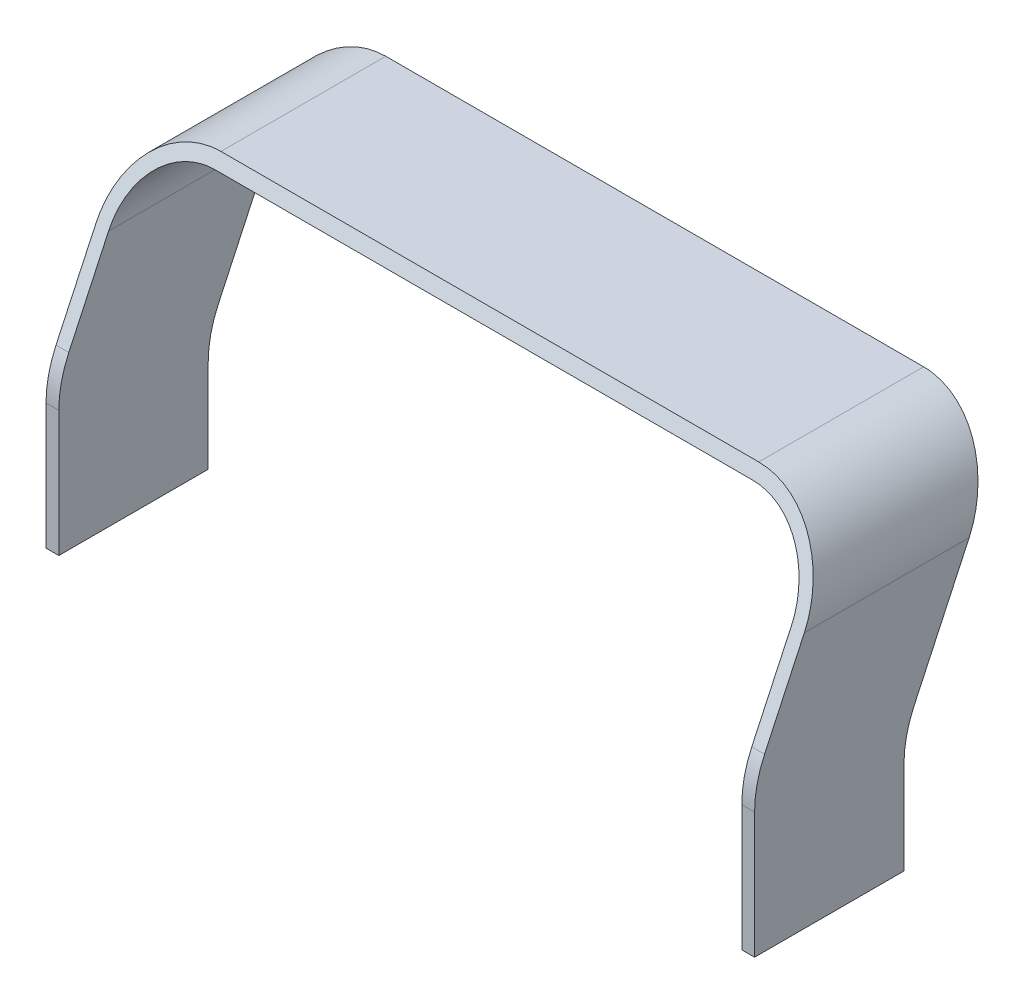
ISO-10303-21;
HEADER;
FILE_DESCRIPTION(('STEP AP214'),'2;1');
FILE_NAME('part.step','',(''),(''),'','','');
FILE_SCHEMA(('AUTOMOTIVE_DESIGN { 1 0 10303 214 1 1 1 1 }'));
ENDSEC;
DATA;
#1=APPLICATION_CONTEXT('core data for automotive mechanical design processes');
#2=APPLICATION_PROTOCOL_DEFINITION('international standard','automotive_design',2000,#1);
#3=PRODUCT_CONTEXT('',#1,'mechanical');
#4=PRODUCT('Part','Part','',(#3));
#5=PRODUCT_RELATED_PRODUCT_CATEGORY('part','',(#4));
#6=PRODUCT_DEFINITION_FORMATION('','',#4);
#7=PRODUCT_DEFINITION_CONTEXT('part definition',#1,'design');
#8=PRODUCT_DEFINITION('design','',#6,#7);
#9=PRODUCT_DEFINITION_SHAPE('','',#8);
#10=(LENGTH_UNIT() NAMED_UNIT(*) SI_UNIT(.MILLI.,.METRE.));
#11=(NAMED_UNIT(*) PLANE_ANGLE_UNIT() SI_UNIT($,.RADIAN.));
#12=(NAMED_UNIT(*) SI_UNIT($,.STERADIAN.) SOLID_ANGLE_UNIT());
#13=UNCERTAINTY_MEASURE_WITH_UNIT(LENGTH_MEASURE(1.E-05),#10,'distance_accuracy_value','');
#14=(GEOMETRIC_REPRESENTATION_CONTEXT(3) GLOBAL_UNCERTAINTY_ASSIGNED_CONTEXT((#13)) GLOBAL_UNIT_ASSIGNED_CONTEXT((#10,
#11,#12)) REPRESENTATION_CONTEXT('',''));
#15=CARTESIAN_POINT('',(0.,0.,0.));
#16=DIRECTION('',(0.,0.,1.));
#17=DIRECTION('',(1.,0.,0.));
#18=AXIS2_PLACEMENT_3D('',#15,#16,#17);
#19=CARTESIAN_POINT('',(-63.,65.,70.));
#20=DIRECTION('',(0.,0.,-1.));
#21=DIRECTION('',(-1.,0.,0.));
#22=AXIS2_PLACEMENT_3D('',#19,#20,#21);
#23=PLANE('',#22);
#24=DIRECTION('',(0.,1.,0.));
#25=VECTOR('',#24,1.);
#26=CARTESIAN_POINT('',(83.0000000000003,64.9999999999999,70.));
#27=LINE('',#26,#25);
#28=CARTESIAN_POINT('',(83.0000000000003,5.,70.));
#29=VERTEX_POINT('',#28);
#30=CARTESIAN_POINT('',(83.0000000000003,34.4576334339265,70.));
#31=VERTEX_POINT('',#30);
#32=EDGE_CURVE('E297',#29,#31,#27,.T.);
#33=ORIENTED_EDGE('',*,*,#32,.T.);
#34=DIRECTION('',(-1.,0.,0.));
#35=VECTOR('',#34,1.);
#36=CARTESIAN_POINT('',(-63.,34.4576334339265,70.));
#37=LINE('',#36,#35);
#38=CARTESIAN_POINT('',(80.0000000000003,34.4576334339265,70.));
#39=VERTEX_POINT('',#38);
#40=EDGE_CURVE('E246',#31,#39,#37,.T.);
#41=ORIENTED_EDGE('',*,*,#40,.T.);
#42=DIRECTION('',(0.,-1.,0.));
#43=VECTOR('',#42,1.);
#44=CARTESIAN_POINT('',(80.0000000000003,65.,70.));
#45=LINE('',#44,#43);
#46=CARTESIAN_POINT('',(80.0000000000003,5.00000000000001,70.));
#47=VERTEX_POINT('',#46);
#48=EDGE_CURVE('E293',#39,#47,#45,.T.);
#49=ORIENTED_EDGE('',*,*,#48,.T.);
#50=DIRECTION('',(1.,0.,0.));
#51=VECTOR('',#50,1.);
#52=CARTESIAN_POINT('',(80.0000000000003,5.00000000000001,70.));
#53=LINE('',#52,#51);
#54=EDGE_CURVE('E295',#47,#29,#53,.T.);
#55=ORIENTED_EDGE('',*,*,#54,.T.);
#56=EDGE_LOOP('',(#33,#41,#49,#55));
#57=FACE_BOUND('',#56,.T.);
#58=ADVANCED_FACE('F35',(#57),#23,.F.);
#59=CARTESIAN_POINT('',(-83.,4.99999999999997,70.));
#60=DIRECTION('',(0.,1.,0.));
#61=DIRECTION('',(-1.,0.,0.));
#62=AXIS2_PLACEMENT_3D('',#59,#60,#61);
#63=PLANE('',#62);
#64=DIRECTION('',(0.,0.,-1.));
#65=VECTOR('',#64,1.);
#66=CARTESIAN_POINT('',(-83.,4.99999999999997,70.));
#67=LINE('',#66,#65);
#68=CARTESIAN_POINT('',(-83.,4.99999999999997,70.));
#69=VERTEX_POINT('',#68);
#70=CARTESIAN_POINT('',(-83.,4.99999999999997,35.));
#71=VERTEX_POINT('',#70);
#72=EDGE_CURVE('E203',#69,#71,#67,.T.);
#73=ORIENTED_EDGE('',*,*,#72,.T.);
#74=DIRECTION('',(1.,0.,0.));
#75=VECTOR('',#74,1.);
#76=CARTESIAN_POINT('',(-83.,4.99999999999997,35.));
#77=LINE('',#76,#75);
#78=CARTESIAN_POINT('',(-80.,5.00000000000001,35.));
#79=VERTEX_POINT('',#78);
#80=EDGE_CURVE('E196',#71,#79,#77,.T.);
#81=ORIENTED_EDGE('',*,*,#80,.T.);
#82=DIRECTION('',(0.,0.,-1.));
#83=VECTOR('',#82,1.);
#84=CARTESIAN_POINT('',(-80.,5.00000000000001,70.));
#85=LINE('',#84,#83);
#86=CARTESIAN_POINT('',(-80.,5.00000000000001,70.));
#87=VERTEX_POINT('',#86);
#88=EDGE_CURVE('E235',#87,#79,#85,.T.);
#89=ORIENTED_EDGE('',*,*,#88,.F.);
#90=DIRECTION('',(1.,0.,0.));
#91=VECTOR('',#90,1.);
#92=CARTESIAN_POINT('',(-83.,4.99999999999997,70.));
#93=LINE('',#92,#91);
#94=EDGE_CURVE('E283',#69,#87,#93,.T.);
#95=ORIENTED_EDGE('',*,*,#94,.F.);
#96=EDGE_LOOP('',(#73,#81,#89,#95));
#97=FACE_BOUND('',#96,.T.);
#98=ADVANCED_FACE('F304',(#97),#63,.F.);
#99=CARTESIAN_POINT('',(-80.,5.00000000000001,70.));
#100=DIRECTION('',(-1.,0.,0.));
#101=DIRECTION('',(0.,0.,1.));
#102=AXIS2_PLACEMENT_3D('',#99,#100,#101);
#103=PLANE('',#102);
#104=DIRECTION('',(0.,-0.906307787036649,0.422618261740701));
#105=VECTOR('',#104,1.);
#106=CARTESIAN_POINT('',(-80.,11.2512168304856,83.4057777545822));
#107=LINE('',#106,#105);
#108=CARTESIAN_POINT('',(-80.,65.,58.342308546125));
#109=VERTEX_POINT('',#108);
#110=CARTESIAN_POINT('',(-80.,45.023089977444,67.6576946759162));
#111=VERTEX_POINT('',#110);
#112=EDGE_CURVE('E308',#109,#111,#107,.T.);
#113=ORIENTED_EDGE('',*,*,#112,.T.);
#114=CARTESIAN_POINT('',(-80.,34.4576334339265,45.));
#115=DIRECTION('',(-1.,0.,0.));
#116=DIRECTION('',(0.,0.,1.));
#117=AXIS2_PLACEMENT_3D('',#114,#115,#116);
#118=CIRCLE('',#117,25.);
#119=CARTESIAN_POINT('',(-80.,34.4576334339265,70.));
#120=VERTEX_POINT('',#119);
#121=EDGE_CURVE('E58',#111,#120,#118,.F.);
#122=ORIENTED_EDGE('',*,*,#121,.T.);
#123=DIRECTION('',(0.,1.,0.));
#124=VECTOR('',#123,1.);
#125=CARTESIAN_POINT('',(-80.,5.00000000000001,70.));
#126=LINE('',#125,#124);
#127=EDGE_CURVE('E286',#87,#120,#126,.T.);
#128=ORIENTED_EDGE('',*,*,#127,.F.);
#129=ORIENTED_EDGE('',*,*,#88,.T.);
#130=DIRECTION('',(0.,1.,0.));
#131=VECTOR('',#130,1.);
#132=CARTESIAN_POINT('',(-80.,5.00000000000001,35.));
#133=LINE('',#132,#131);
#134=CARTESIAN_POINT('',(-80.,26.6983202414236,35.));
#135=VERTEX_POINT('',#134);
#136=EDGE_CURVE('E280',#79,#135,#133,.T.);
#137=ORIENTED_EDGE('',*,*,#136,.T.);
#138=CARTESIAN_POINT('',(-80.,26.6983202414236,10.));
#139=DIRECTION('',(-1.,0.,0.));
#140=DIRECTION('',(0.,0.,1.));
#141=AXIS2_PLACEMENT_3D('',#138,#139,#140);
#142=CIRCLE('',#141,25.);
#143=CARTESIAN_POINT('',(-80.,37.2637767849411,32.6576946759162));
#144=VERTEX_POINT('',#143);
#145=EDGE_CURVE('E11',#135,#144,#142,.T.);
#146=ORIENTED_EDGE('',*,*,#145,.T.);
#147=DIRECTION('',(0.,0.906307787036649,-0.422618261740701));
#148=VECTOR('',#147,1.);
#149=CARTESIAN_POINT('',(-80.,-3.54042233043891,51.6850052082995));
#150=LINE('',#149,#148);
#151=CARTESIAN_POINT('',(-80.,65.,19.7240813824378));
#152=VERTEX_POINT('',#151);
#153=EDGE_CURVE('E278',#144,#152,#150,.T.);
#154=ORIENTED_EDGE('',*,*,#153,.T.);
#155=DIRECTION('',(0.,0.,-1.));
#156=VECTOR('',#155,1.);
#157=CARTESIAN_POINT('',(-80.,65.,70.));
#158=LINE('',#157,#156);
#159=EDGE_CURVE('E232',#109,#152,#158,.T.);
#160=ORIENTED_EDGE('',*,*,#159,.F.);
#161=EDGE_LOOP('',(#113,#122,#128,#129,#137,#146,#154,#160));
#162=FACE_BOUND('',#161,.T.);
#163=ADVANCED_FACE('F276',(#162),#103,.F.);
#164=CARTESIAN_POINT('',(-63.,65.,70.));
#165=DIRECTION('',(0.,0.,-1.));
#166=DIRECTION('',(-1.,0.,0.));
#167=AXIS2_PLACEMENT_3D('',#164,#165,#166);
#168=CYLINDRICAL_SURFACE('',#167,17.);
#169=DIRECTION('',(0.,0.,-1.));
#170=VECTOR('',#169,1.);
#171=CARTESIAN_POINT('',(-63.,82.,70.));
#172=LINE('',#171,#170);
#173=CARTESIAN_POINT('',(-63.,82.,50.41507835749));
#174=VERTEX_POINT('',#173);
#175=CARTESIAN_POINT('',(-63.,82.,11.7968511938027));
#176=VERTEX_POINT('',#175);
#177=EDGE_CURVE('E229',#174,#176,#172,.T.);
#178=ORIENTED_EDGE('',*,*,#177,.F.);
#179=CARTESIAN_POINT('',(-63.,65.,58.342308546125));
#180=DIRECTION('',(0.,-0.422618261740701,-0.906307787036649));
#181=DIRECTION('',(0.,0.906307787036649,-0.422618261740701));
#182=AXIS2_PLACEMENT_3D('',#179,#180,#181);
#183=ELLIPSE('',#182,18.7574246223624,17.);
#184=EDGE_CURVE('E311',#174,#109,#183,.F.);
#185=ORIENTED_EDGE('',*,*,#184,.T.);
#186=ORIENTED_EDGE('',*,*,#159,.T.);
#187=CARTESIAN_POINT('',(-63.,65.,19.7240813824377));
#188=DIRECTION('',(0.,0.422618261740701,0.906307787036649));
#189=DIRECTION('',(0.,0.906307787036649,-0.422618261740701));
#190=AXIS2_PLACEMENT_3D('',#187,#188,#189);
#191=ELLIPSE('',#190,18.7574246223624,17.);
#192=EDGE_CURVE('E282',#152,#176,#191,.F.);
#193=ORIENTED_EDGE('',*,*,#192,.T.);
#194=EDGE_LOOP('',(#178,#185,#186,#193));
#195=FACE_BOUND('',#194,.T.);
#196=ADVANCED_FACE('F434',(#195),#168,.F.);
#197=CARTESIAN_POINT('',(-63.,82.,70.));
#198=DIRECTION('',(0.,1.,0.));
#199=DIRECTION('',(0.,0.,1.));
#200=AXIS2_PLACEMENT_3D('',#197,#198,#199);
#201=PLANE('',#200);
#202=DIRECTION('',(0.,0.,-1.));
#203=VECTOR('',#202,1.);
#204=CARTESIAN_POINT('',(63.0000000000003,82.,70.));
#205=LINE('',#204,#203);
#206=CARTESIAN_POINT('',(63.0000000000003,82.,50.41507835749));
#207=VERTEX_POINT('',#206);
#208=CARTESIAN_POINT('',(63.0000000000003,82.,11.7968511938027));
#209=VERTEX_POINT('',#208);
#210=EDGE_CURVE('E226',#207,#209,#205,.T.);
#211=ORIENTED_EDGE('',*,*,#210,.F.);
#212=DIRECTION('',(-1.,0.,0.));
#213=VECTOR('',#212,1.);
#214=CARTESIAN_POINT('',(-63.,82.,50.41507835749));
#215=LINE('',#214,#213);
#216=EDGE_CURVE('E316',#207,#174,#215,.T.);
#217=ORIENTED_EDGE('',*,*,#216,.T.);
#218=ORIENTED_EDGE('',*,*,#177,.T.);
#219=DIRECTION('',(1.,0.,0.));
#220=VECTOR('',#219,1.);
#221=CARTESIAN_POINT('',(-63.,82.,11.7968511938027));
#222=LINE('',#221,#220);
#223=EDGE_CURVE('E288',#176,#209,#222,.T.);
#224=ORIENTED_EDGE('',*,*,#223,.T.);
#225=EDGE_LOOP('',(#211,#217,#218,#224));
#226=FACE_BOUND('',#225,.T.);
#227=ADVANCED_FACE('F333',(#226),#201,.F.);
#228=CARTESIAN_POINT('',(63.0000000000003,65.,70.));
#229=DIRECTION('',(0.,0.,-1.));
#230=DIRECTION('',(-1.,0.,0.));
#231=AXIS2_PLACEMENT_3D('',#228,#229,#230);
#232=CYLINDRICAL_SURFACE('',#231,17.);
#233=DIRECTION('',(0.,0.,-1.));
#234=VECTOR('',#233,1.);
#235=CARTESIAN_POINT('',(80.0000000000003,65.,70.));
#236=LINE('',#235,#234);
#237=CARTESIAN_POINT('',(80.0000000000003,65.,58.342308546125));
#238=VERTEX_POINT('',#237);
#239=CARTESIAN_POINT('',(80.0000000000003,65.,19.7240813824378));
#240=VERTEX_POINT('',#239);
#241=EDGE_CURVE('E223',#238,#240,#236,.T.);
#242=ORIENTED_EDGE('',*,*,#241,.F.);
#243=CARTESIAN_POINT('',(63.0000000000003,65.,58.342308546125));
#244=DIRECTION('',(0.,-0.422618261740701,-0.906307787036649));
#245=DIRECTION('',(0.,0.906307787036649,-0.422618261740701));
#246=AXIS2_PLACEMENT_3D('',#243,#244,#245);
#247=ELLIPSE('',#246,18.7574246223624,17.);
#248=EDGE_CURVE('E341',#238,#207,#247,.F.);
#249=ORIENTED_EDGE('',*,*,#248,.T.);
#250=ORIENTED_EDGE('',*,*,#210,.T.);
#251=CARTESIAN_POINT('',(63.0000000000003,65.,19.7240813824378));
#252=DIRECTION('',(0.,0.422618261740701,0.906307787036649));
#253=DIRECTION('',(0.,0.906307787036649,-0.422618261740701));
#254=AXIS2_PLACEMENT_3D('',#251,#252,#253);
#255=ELLIPSE('',#254,18.7574246223624,17.);
#256=EDGE_CURVE('E328',#209,#240,#255,.F.);
#257=ORIENTED_EDGE('',*,*,#256,.T.);
#258=EDGE_LOOP('',(#242,#249,#250,#257));
#259=FACE_BOUND('',#258,.T.);
#260=ADVANCED_FACE('F339',(#259),#232,.F.);
#261=CARTESIAN_POINT('',(80.0000000000003,65.,70.));
#262=DIRECTION('',(1.,0.,0.));
#263=DIRECTION('',(0.,1.,0.));
#264=AXIS2_PLACEMENT_3D('',#261,#262,#263);
#265=PLANE('',#264);
#266=ORIENTED_EDGE('',*,*,#48,.F.);
#267=CARTESIAN_POINT('',(80.0000000000003,34.4576334339265,45.));
#268=DIRECTION('',(1.,0.,0.));
#269=DIRECTION('',(0.,1.,0.));
#270=AXIS2_PLACEMENT_3D('',#267,#268,#269);
#271=CIRCLE('',#270,25.);
#272=CARTESIAN_POINT('',(80.0000000000003,45.023089977444,67.6576946759162));
#273=VERTEX_POINT('',#272);
#274=EDGE_CURVE('E249',#39,#273,#271,.F.);
#275=ORIENTED_EDGE('',*,*,#274,.T.);
#276=DIRECTION('',(0.,0.906307787036649,-0.422618261740701));
#277=VECTOR('',#276,1.);
#278=CARTESIAN_POINT('',(80.0000000000003,60.5348451210817,60.4244444610128));
#279=LINE('',#278,#277);
#280=EDGE_CURVE('E342',#273,#238,#279,.T.);
#281=ORIENTED_EDGE('',*,*,#280,.T.);
#282=ORIENTED_EDGE('',*,*,#241,.T.);
#283=DIRECTION('',(0.,-0.906307787036649,0.422618261740701));
#284=VECTOR('',#283,1.);
#285=CARTESIAN_POINT('',(80.0000000000003,45.7432059601572,28.70367191473));
#286=LINE('',#285,#284);
#287=CARTESIAN_POINT('',(80.0000000000003,37.2637767849411,32.6576946759162));
#288=VERTEX_POINT('',#287);
#289=EDGE_CURVE('E325',#240,#288,#286,.T.);
#290=ORIENTED_EDGE('',*,*,#289,.T.);
#291=CARTESIAN_POINT('',(80.0000000000003,26.6983202414236,10.));
#292=DIRECTION('',(1.,0.,0.));
#293=DIRECTION('',(0.,1.,0.));
#294=AXIS2_PLACEMENT_3D('',#291,#292,#293);
#295=CIRCLE('',#294,25.);
#296=CARTESIAN_POINT('',(80.0000000000003,26.6983202414236,35.));
#297=VERTEX_POINT('',#296);
#298=EDGE_CURVE('E261',#288,#297,#295,.T.);
#299=ORIENTED_EDGE('',*,*,#298,.T.);
#300=DIRECTION('',(0.,-1.,0.));
#301=VECTOR('',#300,1.);
#302=CARTESIAN_POINT('',(80.0000000000003,65.,35.));
#303=LINE('',#302,#301);
#304=CARTESIAN_POINT('',(80.0000000000003,5.00000000000001,35.));
#305=VERTEX_POINT('',#304);
#306=EDGE_CURVE('E314',#297,#305,#303,.T.);
#307=ORIENTED_EDGE('',*,*,#306,.T.);
#308=DIRECTION('',(0.,0.,-1.));
#309=VECTOR('',#308,1.);
#310=CARTESIAN_POINT('',(80.0000000000003,5.00000000000001,70.));
#311=LINE('',#310,#309);
#312=EDGE_CURVE('E220',#47,#305,#311,.T.);
#313=ORIENTED_EDGE('',*,*,#312,.F.);
#314=EDGE_LOOP('',(#266,#275,#281,#282,#290,#299,#307,#313));
#315=FACE_BOUND('',#314,.T.);
#316=ADVANCED_FACE('F375',(#315),#265,.F.);
#317=CARTESIAN_POINT('',(80.0000000000003,5.00000000000001,70.));
#318=DIRECTION('',(0.,1.,0.));
#319=DIRECTION('',(-1.,0.,0.));
#320=AXIS2_PLACEMENT_3D('',#317,#318,#319);
#321=PLANE('',#320);
#322=ORIENTED_EDGE('',*,*,#312,.T.);
#323=DIRECTION('',(1.,0.,0.));
#324=VECTOR('',#323,1.);
#325=CARTESIAN_POINT('',(80.0000000000003,5.00000000000001,35.));
#326=LINE('',#325,#324);
#327=CARTESIAN_POINT('',(83.0000000000003,5.,35.));
#328=VERTEX_POINT('',#327);
#329=EDGE_CURVE('E310',#305,#328,#326,.T.);
#330=ORIENTED_EDGE('',*,*,#329,.T.);
#331=DIRECTION('',(0.,0.,-1.));
#332=VECTOR('',#331,1.);
#333=CARTESIAN_POINT('',(83.0000000000003,5.,70.));
#334=LINE('',#333,#332);
#335=EDGE_CURVE('E217',#29,#328,#334,.T.);
#336=ORIENTED_EDGE('',*,*,#335,.F.);
#337=ORIENTED_EDGE('',*,*,#54,.F.);
#338=EDGE_LOOP('',(#322,#330,#336,#337));
#339=FACE_BOUND('',#338,.T.);
#340=ADVANCED_FACE('F381',(#339),#321,.F.);
#341=CARTESIAN_POINT('',(83.0000000000003,64.9999999999999,70.));
#342=DIRECTION('',(-1.,0.,0.));
#343=DIRECTION('',(0.,-1.,0.));
#344=AXIS2_PLACEMENT_3D('',#341,#342,#343);
#345=PLANE('',#344);
#346=DIRECTION('',(0.,-0.906307787036649,0.422618261740701));
#347=VECTOR('',#346,1.);
#348=CARTESIAN_POINT('',(83.0000000000003,85.,49.016155383025));
#349=LINE('',#348,#347);
#350=CARTESIAN_POINT('',(83.0000000000003,65.,58.342308546125));
#351=VERTEX_POINT('',#350);
#352=CARTESIAN_POINT('',(83.0000000000003,45.023089977444,67.6576946759162));
#353=VERTEX_POINT('',#352);
#354=EDGE_CURVE('E359',#351,#353,#349,.T.);
#355=ORIENTED_EDGE('',*,*,#354,.T.);
#356=CARTESIAN_POINT('',(83.0000000000003,34.4576334339265,45.));
#357=DIRECTION('',(-1.,0.,0.));
#358=DIRECTION('',(0.,-1.,0.));
#359=AXIS2_PLACEMENT_3D('',#356,#357,#358);
#360=CIRCLE('',#359,25.);
#361=EDGE_CURVE('E255',#353,#31,#360,.F.);
#362=ORIENTED_EDGE('',*,*,#361,.T.);
#363=ORIENTED_EDGE('',*,*,#32,.F.);
#364=ORIENTED_EDGE('',*,*,#335,.T.);
#365=DIRECTION('',(0.,1.,0.));
#366=VECTOR('',#365,1.);
#367=CARTESIAN_POINT('',(83.0000000000003,32.2406868074971,35.));
#368=LINE('',#367,#366);
#369=CARTESIAN_POINT('',(83.0000000000003,26.6983202414236,35.));
#370=VERTEX_POINT('',#369);
#371=EDGE_CURVE('E184',#328,#370,#368,.T.);
#372=ORIENTED_EDGE('',*,*,#371,.T.);
#373=CARTESIAN_POINT('',(83.0000000000003,26.6983202414236,10.));
#374=DIRECTION('',(-1.,0.,0.));
#375=DIRECTION('',(0.,-1.,0.));
#376=AXIS2_PLACEMENT_3D('',#373,#374,#375);
#377=CIRCLE('',#376,25.);
#378=CARTESIAN_POINT('',(83.0000000000003,37.2637767849411,32.6576946759162));
#379=VERTEX_POINT('',#378);
#380=EDGE_CURVE('E263',#370,#379,#377,.T.);
#381=ORIENTED_EDGE('',*,*,#380,.T.);
#382=DIRECTION('',(0.,0.906307787036649,-0.422618261740701));
#383=VECTOR('',#382,1.);
#384=CARTESIAN_POINT('',(83.0000000000003,85.,10.3979282193377));
#385=LINE('',#384,#383);
#386=CARTESIAN_POINT('',(83.0000000000003,65.,19.7240813824378));
#387=VERTEX_POINT('',#386);
#388=EDGE_CURVE('E353',#379,#387,#385,.T.);
#389=ORIENTED_EDGE('',*,*,#388,.T.);
#390=DIRECTION('',(0.,0.,-1.));
#391=VECTOR('',#390,1.);
#392=CARTESIAN_POINT('',(83.0000000000003,64.9999999999999,70.));
#393=LINE('',#392,#391);
#394=EDGE_CURVE('E214',#351,#387,#393,.T.);
#395=ORIENTED_EDGE('',*,*,#394,.F.);
#396=EDGE_LOOP('',(#355,#362,#363,#364,#372,#381,#389,#395));
#397=FACE_BOUND('',#396,.T.);
#398=ADVANCED_FACE('F365',(#397),#345,.F.);
#399=CARTESIAN_POINT('',(63.0000000000003,65.,70.));
#400=DIRECTION('',(0.,0.,-1.));
#401=DIRECTION('',(-1.,0.,0.));
#402=AXIS2_PLACEMENT_3D('',#399,#400,#401);
#403=CYLINDRICAL_SURFACE('',#402,20.);
#404=DIRECTION('',(0.,0.,-1.));
#405=VECTOR('',#404,1.);
#406=CARTESIAN_POINT('',(63.0000000000001,85.,70.));
#407=LINE('',#406,#405);
#408=CARTESIAN_POINT('',(63.0000000000001,85.,49.016155383025));
#409=VERTEX_POINT('',#408);
#410=CARTESIAN_POINT('',(63.0000000000001,85.,10.3979282193377));
#411=VERTEX_POINT('',#410);
#412=EDGE_CURVE('E205',#409,#411,#407,.T.);
#413=ORIENTED_EDGE('',*,*,#412,.F.);
#414=CARTESIAN_POINT('',(63.0000000000003,65.,58.342308546125));
#415=DIRECTION('',(0.,-0.422618261740701,-0.906307787036649));
#416=DIRECTION('',(0.,0.906307787036649,-0.422618261740701));
#417=AXIS2_PLACEMENT_3D('',#414,#415,#416);
#418=ELLIPSE('',#417,22.0675583792499,20.);
#419=EDGE_CURVE('E344',#409,#351,#418,.T.);
#420=ORIENTED_EDGE('',*,*,#419,.T.);
#421=ORIENTED_EDGE('',*,*,#394,.T.);
#422=CARTESIAN_POINT('',(63.0000000000003,65.,19.7240813824378));
#423=DIRECTION('',(0.,0.422618261740701,0.906307787036649));
#424=DIRECTION('',(0.,0.906307787036649,-0.422618261740701));
#425=AXIS2_PLACEMENT_3D('',#422,#423,#424);
#426=ELLIPSE('',#425,22.0675583792499,20.);
#427=EDGE_CURVE('E195',#387,#411,#426,.T.);
#428=ORIENTED_EDGE('',*,*,#427,.T.);
#429=EDGE_LOOP('',(#413,#420,#421,#428));
#430=FACE_BOUND('',#429,.T.);
#431=ADVANCED_FACE('F419',(#430),#403,.T.);
#432=CARTESIAN_POINT('',(-62.9999999999999,85.,70.));
#433=DIRECTION('',(0.,-1.,0.));
#434=DIRECTION('',(0.,0.,-1.));
#435=AXIS2_PLACEMENT_3D('',#432,#433,#434);
#436=PLANE('',#435);
#437=DIRECTION('',(0.,0.,-1.));
#438=VECTOR('',#437,1.);
#439=CARTESIAN_POINT('',(-62.9999999999999,85.,70.));
#440=LINE('',#439,#438);
#441=CARTESIAN_POINT('',(-63.,85.,49.016155383025));
#442=VERTEX_POINT('',#441);
#443=CARTESIAN_POINT('',(-63.,85.,10.3979282193377));
#444=VERTEX_POINT('',#443);
#445=EDGE_CURVE('E194',#442,#444,#440,.T.);
#446=ORIENTED_EDGE('',*,*,#445,.F.);
#447=DIRECTION('',(-1.,0.,0.));
#448=VECTOR('',#447,1.);
#449=CARTESIAN_POINT('',(83.0000000000003,85.,49.016155383025));
#450=LINE('',#449,#448);
#451=EDGE_CURVE('E351',#409,#442,#450,.T.);
#452=ORIENTED_EDGE('',*,*,#451,.F.);
#453=ORIENTED_EDGE('',*,*,#412,.T.);
#454=DIRECTION('',(-1.,0.,0.));
#455=VECTOR('',#454,1.);
#456=CARTESIAN_POINT('',(83.0000000000003,85.,10.3979282193377));
#457=LINE('',#456,#455);
#458=EDGE_CURVE('E352',#411,#444,#457,.T.);
#459=ORIENTED_EDGE('',*,*,#458,.T.);
#460=EDGE_LOOP('',(#446,#452,#453,#459));
#461=FACE_BOUND('',#460,.T.);
#462=ADVANCED_FACE('F414',(#461),#436,.F.);
#463=CARTESIAN_POINT('',(-63.,65.,70.));
#464=DIRECTION('',(0.,0.,-1.));
#465=DIRECTION('',(-1.,0.,0.));
#466=AXIS2_PLACEMENT_3D('',#463,#464,#465);
#467=CYLINDRICAL_SURFACE('',#466,20.);
#468=DIRECTION('',(0.,0.,-1.));
#469=VECTOR('',#468,1.);
#470=CARTESIAN_POINT('',(-83.,64.9999999999999,70.));
#471=LINE('',#470,#469);
#472=CARTESIAN_POINT('',(-83.,64.9999999999999,58.3423085461251));
#473=VERTEX_POINT('',#472);
#474=CARTESIAN_POINT('',(-83.,64.9999999999999,19.7240813824378));
#475=VERTEX_POINT('',#474);
#476=EDGE_CURVE('E192',#473,#475,#471,.T.);
#477=ORIENTED_EDGE('',*,*,#476,.F.);
#478=CARTESIAN_POINT('',(-63.,65.,58.342308546125));
#479=DIRECTION('',(0.,-0.422618261740701,-0.906307787036649));
#480=DIRECTION('',(0.,0.906307787036649,-0.422618261740701));
#481=AXIS2_PLACEMENT_3D('',#478,#479,#480);
#482=ELLIPSE('',#481,22.0675583792498,20.);
#483=EDGE_CURVE('E349',#473,#442,#482,.T.);
#484=ORIENTED_EDGE('',*,*,#483,.T.);
#485=ORIENTED_EDGE('',*,*,#445,.T.);
#486=CARTESIAN_POINT('',(-63.,65.,19.7240813824377));
#487=DIRECTION('',(0.,0.422618261740701,0.906307787036649));
#488=DIRECTION('',(0.,0.906307787036649,-0.422618261740701));
#489=AXIS2_PLACEMENT_3D('',#486,#487,#488);
#490=ELLIPSE('',#489,22.0675583792498,20.);
#491=EDGE_CURVE('E177',#444,#475,#490,.T.);
#492=ORIENTED_EDGE('',*,*,#491,.T.);
#493=EDGE_LOOP('',(#477,#484,#485,#492));
#494=FACE_BOUND('',#493,.T.);
#495=ADVANCED_FACE('F190',(#494),#467,.T.);
#496=CARTESIAN_POINT('',(-83.,4.99999999999997,70.));
#497=DIRECTION('',(1.,0.,0.));
#498=DIRECTION('',(0.,0.,-1.));
#499=AXIS2_PLACEMENT_3D('',#496,#497,#498);
#500=PLANE('',#499);
#501=DIRECTION('',(0.,-1.,0.));
#502=VECTOR('',#501,1.);
#503=CARTESIAN_POINT('',(-83.,4.99999999999997,70.));
#504=LINE('',#503,#502);
#505=CARTESIAN_POINT('',(-83.,34.4576334339265,70.));
#506=VERTEX_POINT('',#505);
#507=EDGE_CURVE('E208',#506,#69,#504,.T.);
#508=ORIENTED_EDGE('',*,*,#507,.F.);
#509=CARTESIAN_POINT('',(-83.,34.4576334339265,45.));
#510=DIRECTION('',(1.,0.,0.));
#511=DIRECTION('',(0.,0.,-1.));
#512=AXIS2_PLACEMENT_3D('',#509,#510,#511);
#513=CIRCLE('',#512,25.);
#514=CARTESIAN_POINT('',(-83.,45.023089977444,67.6576946759162));
#515=VERTEX_POINT('',#514);
#516=EDGE_CURVE('E50',#506,#515,#513,.F.);
#517=ORIENTED_EDGE('',*,*,#516,.T.);
#518=DIRECTION('',(0.,-0.906307787036649,0.422618261740701));
#519=VECTOR('',#518,1.);
#520=CARTESIAN_POINT('',(-83.,85.,49.016155383025));
#521=LINE('',#520,#519);
#522=EDGE_CURVE('E202',#473,#515,#521,.T.);
#523=ORIENTED_EDGE('',*,*,#522,.F.);
#524=ORIENTED_EDGE('',*,*,#476,.T.);
#525=DIRECTION('',(0.,0.906307787036649,-0.422618261740701));
#526=VECTOR('',#525,1.);
#527=CARTESIAN_POINT('',(-83.,85.,10.3979282193377));
#528=LINE('',#527,#526);
#529=CARTESIAN_POINT('',(-83.,37.2637767849411,32.6576946759162));
#530=VERTEX_POINT('',#529);
#531=EDGE_CURVE('E173',#530,#475,#528,.T.);
#532=ORIENTED_EDGE('',*,*,#531,.F.);
#533=CARTESIAN_POINT('',(-83.,26.6983202414236,10.));
#534=DIRECTION('',(1.,0.,0.));
#535=DIRECTION('',(0.,0.,-1.));
#536=AXIS2_PLACEMENT_3D('',#533,#534,#535);
#537=CIRCLE('',#536,25.);
#538=CARTESIAN_POINT('',(-83.,26.6983202414236,35.));
#539=VERTEX_POINT('',#538);
#540=EDGE_CURVE('E43',#530,#539,#537,.T.);
#541=ORIENTED_EDGE('',*,*,#540,.T.);
#542=DIRECTION('',(0.,1.,0.));
#543=VECTOR('',#542,1.);
#544=CARTESIAN_POINT('',(-83.,32.2406868074971,35.));
#545=LINE('',#544,#543);
#546=EDGE_CURVE('E185',#71,#539,#545,.T.);
#547=ORIENTED_EDGE('',*,*,#546,.F.);
#548=ORIENTED_EDGE('',*,*,#72,.F.);
#549=EDGE_LOOP('',(#508,#517,#523,#524,#532,#541,#547,#548));
#550=FACE_BOUND('',#549,.T.);
#551=ADVANCED_FACE('F200',(#550),#500,.F.);
#552=ORIENTED_EDGE('',*,*,#127,.T.);
#553=DIRECTION('',(-1.,0.,0.));
#554=VECTOR('',#553,1.);
#555=CARTESIAN_POINT('',(-63.,34.4576334339265,70.));
#556=LINE('',#555,#554);
#557=EDGE_CURVE('E257',#120,#506,#556,.T.);
#558=ORIENTED_EDGE('',*,*,#557,.T.);
#559=ORIENTED_EDGE('',*,*,#507,.T.);
#560=ORIENTED_EDGE('',*,*,#94,.T.);
#561=EDGE_LOOP('',(#552,#558,#559,#560));
#562=FACE_BOUND('',#561,.T.);
#563=ADVANCED_FACE('F300',(#562),#23,.F.);
#564=CARTESIAN_POINT('',(83.0000000000003,85.,49.016155383025));
#565=DIRECTION('',(0.,-0.422618261740701,-0.906307787036649));
#566=DIRECTION('',(0.,0.906307787036649,-0.422618261740701));
#567=AXIS2_PLACEMENT_3D('',#564,#565,#566);
#568=PLANE('',#567);
#569=ORIENTED_EDGE('',*,*,#280,.F.);
#570=DIRECTION('',(-1.,0.,0.));
#571=VECTOR('',#570,1.);
#572=CARTESIAN_POINT('',(83.0000000000003,45.023089977444,67.6576946759162));
#573=LINE('',#572,#571);
#574=EDGE_CURVE('E253',#273,#353,#573,.F.);
#575=ORIENTED_EDGE('',*,*,#574,.T.);
#576=ORIENTED_EDGE('',*,*,#354,.F.);
#577=ORIENTED_EDGE('',*,*,#419,.F.);
#578=ORIENTED_EDGE('',*,*,#451,.T.);
#579=ORIENTED_EDGE('',*,*,#483,.F.);
#580=ORIENTED_EDGE('',*,*,#522,.T.);
#581=DIRECTION('',(-1.,0.,0.));
#582=VECTOR('',#581,1.);
#583=CARTESIAN_POINT('',(83.0000000000003,45.023089977444,67.6576946759162));
#584=LINE('',#583,#582);
#585=EDGE_CURVE('E251',#515,#111,#584,.F.);
#586=ORIENTED_EDGE('',*,*,#585,.T.);
#587=ORIENTED_EDGE('',*,*,#112,.F.);
#588=ORIENTED_EDGE('',*,*,#184,.F.);
#589=ORIENTED_EDGE('',*,*,#216,.F.);
#590=ORIENTED_EDGE('',*,*,#248,.F.);
#591=EDGE_LOOP('',(#569,#575,#576,#577,#578,#579,#580,#586,#587,#588,#589,#590));
#592=FACE_BOUND('',#591,.T.);
#593=ADVANCED_FACE('F307',(#592),#568,.F.);
#594=CARTESIAN_POINT('',(83.0000000000003,85.,10.3979282193377));
#595=DIRECTION('',(0.,0.422618261740701,0.906307787036649));
#596=DIRECTION('',(0.,-0.906307787036649,0.422618261740701));
#597=AXIS2_PLACEMENT_3D('',#594,#595,#596);
#598=PLANE('',#597);
#599=ORIENTED_EDGE('',*,*,#388,.F.);
#600=DIRECTION('',(-1.,0.,0.));
#601=VECTOR('',#600,1.);
#602=CARTESIAN_POINT('',(80.0000000000003,37.2637767849411,32.6576946759162));
#603=LINE('',#602,#601);
#604=EDGE_CURVE('E239',#379,#288,#603,.T.);
#605=ORIENTED_EDGE('',*,*,#604,.T.);
#606=ORIENTED_EDGE('',*,*,#289,.F.);
#607=ORIENTED_EDGE('',*,*,#256,.F.);
#608=ORIENTED_EDGE('',*,*,#223,.F.);
#609=ORIENTED_EDGE('',*,*,#192,.F.);
#610=ORIENTED_EDGE('',*,*,#153,.F.);
#611=DIRECTION('',(-1.,0.,0.));
#612=VECTOR('',#611,1.);
#613=CARTESIAN_POINT('',(-82.9999999999999,37.2637767849411,32.6576946759162));
#614=LINE('',#613,#612);
#615=EDGE_CURVE('E181',#144,#530,#614,.T.);
#616=ORIENTED_EDGE('',*,*,#615,.T.);
#617=ORIENTED_EDGE('',*,*,#531,.T.);
#618=ORIENTED_EDGE('',*,*,#491,.F.);
#619=ORIENTED_EDGE('',*,*,#458,.F.);
#620=ORIENTED_EDGE('',*,*,#427,.F.);
#621=EDGE_LOOP('',(#599,#605,#606,#607,#608,#609,#610,#616,#617,#618,#619,#620));
#622=FACE_BOUND('',#621,.T.);
#623=ADVANCED_FACE('F176',(#622),#598,.F.);
#624=CARTESIAN_POINT('',(83.0000000000003,32.2406868074971,35.));
#625=DIRECTION('',(0.,0.,1.));
#626=DIRECTION('',(1.,0.,0.));
#627=AXIS2_PLACEMENT_3D('',#624,#625,#626);
#628=PLANE('',#627);
#629=ORIENTED_EDGE('',*,*,#546,.T.);
#630=DIRECTION('',(-1.,0.,0.));
#631=VECTOR('',#630,1.);
#632=CARTESIAN_POINT('',(-79.9999999999999,26.6983202414236,35.));
#633=LINE('',#632,#631);
#634=EDGE_CURVE('E244',#539,#135,#633,.F.);
#635=ORIENTED_EDGE('',*,*,#634,.T.);
#636=ORIENTED_EDGE('',*,*,#136,.F.);
#637=ORIENTED_EDGE('',*,*,#80,.F.);
#638=EDGE_LOOP('',(#629,#635,#636,#637));
#639=FACE_BOUND('',#638,.T.);
#640=ADVANCED_FACE('F270',(#639),#628,.F.);
#641=ORIENTED_EDGE('',*,*,#306,.F.);
#642=DIRECTION('',(-1.,0.,0.));
#643=VECTOR('',#642,1.);
#644=CARTESIAN_POINT('',(83.0000000000003,26.6983202414236,35.));
#645=LINE('',#644,#643);
#646=EDGE_CURVE('E242',#297,#370,#645,.F.);
#647=ORIENTED_EDGE('',*,*,#646,.T.);
#648=ORIENTED_EDGE('',*,*,#371,.F.);
#649=ORIENTED_EDGE('',*,*,#329,.F.);
#650=EDGE_LOOP('',(#641,#647,#648,#649));
#651=FACE_BOUND('',#650,.T.);
#652=ADVANCED_FACE('F389',(#651),#628,.F.);
#653=CARTESIAN_POINT('',(83.0000000000003,26.6983202414236,10.));
#654=DIRECTION('',(1.,0.,0.));
#655=DIRECTION('',(0.,0.,-1.));
#656=AXIS2_PLACEMENT_3D('',#653,#654,#655);
#657=CYLINDRICAL_SURFACE('',#656,25.);
#658=ORIENTED_EDGE('',*,*,#380,.F.);
#659=ORIENTED_EDGE('',*,*,#646,.F.);
#660=ORIENTED_EDGE('',*,*,#298,.F.);
#661=ORIENTED_EDGE('',*,*,#604,.F.);
#662=EDGE_LOOP('',(#658,#659,#660,#661));
#663=FACE_BOUND('',#662,.T.);
#664=ADVANCED_FACE('F387',(#663),#657,.F.);
#665=CARTESIAN_POINT('',(83.0000000000003,26.6983202414236,10.));
#666=DIRECTION('',(1.,0.,0.));
#667=DIRECTION('',(0.,0.,-1.));
#668=AXIS2_PLACEMENT_3D('',#665,#666,#667);
#669=CYLINDRICAL_SURFACE('',#668,25.);
#670=ORIENTED_EDGE('',*,*,#145,.F.);
#671=ORIENTED_EDGE('',*,*,#634,.F.);
#672=ORIENTED_EDGE('',*,*,#540,.F.);
#673=ORIENTED_EDGE('',*,*,#615,.F.);
#674=EDGE_LOOP('',(#670,#671,#672,#673));
#675=FACE_BOUND('',#674,.T.);
#676=ADVANCED_FACE('F275',(#675),#669,.F.);
#677=CARTESIAN_POINT('',(-63.,34.4576334339265,45.));
#678=DIRECTION('',(-1.,0.,0.));
#679=DIRECTION('',(0.,0.,1.));
#680=AXIS2_PLACEMENT_3D('',#677,#678,#679);
#681=CYLINDRICAL_SURFACE('',#680,25.);
#682=ORIENTED_EDGE('',*,*,#361,.F.);
#683=ORIENTED_EDGE('',*,*,#574,.F.);
#684=ORIENTED_EDGE('',*,*,#274,.F.);
#685=ORIENTED_EDGE('',*,*,#40,.F.);
#686=EDGE_LOOP('',(#682,#683,#684,#685));
#687=FACE_BOUND('',#686,.T.);
#688=ADVANCED_FACE('F370',(#687),#681,.T.);
#689=CARTESIAN_POINT('',(-63.,34.4576334339265,45.));
#690=DIRECTION('',(-1.,0.,0.));
#691=DIRECTION('',(0.,0.,1.));
#692=AXIS2_PLACEMENT_3D('',#689,#690,#691);
#693=CYLINDRICAL_SURFACE('',#692,25.);
#694=ORIENTED_EDGE('',*,*,#121,.F.);
#695=ORIENTED_EDGE('',*,*,#585,.F.);
#696=ORIENTED_EDGE('',*,*,#516,.F.);
#697=ORIENTED_EDGE('',*,*,#557,.F.);
#698=EDGE_LOOP('',(#694,#695,#696,#697));
#699=FACE_BOUND('',#698,.T.);
#700=ADVANCED_FACE('F37',(#699),#693,.T.);
#701=CLOSED_SHELL('',(#58,#98,#163,#196,#227,#260,#316,#340,#398,#431,#462,#495,#551,#563,#593,
#623,#640,#652,#664,#676,#688,#700));
#702=MANIFOLD_SOLID_BREP('B2',#701);
#703=ADVANCED_BREP_SHAPE_REPRESENTATION('',(#18,#702),#14);
#704=SHAPE_DEFINITION_REPRESENTATION(#9,#703);
ENDSEC;
END-ISO-10303-21;
